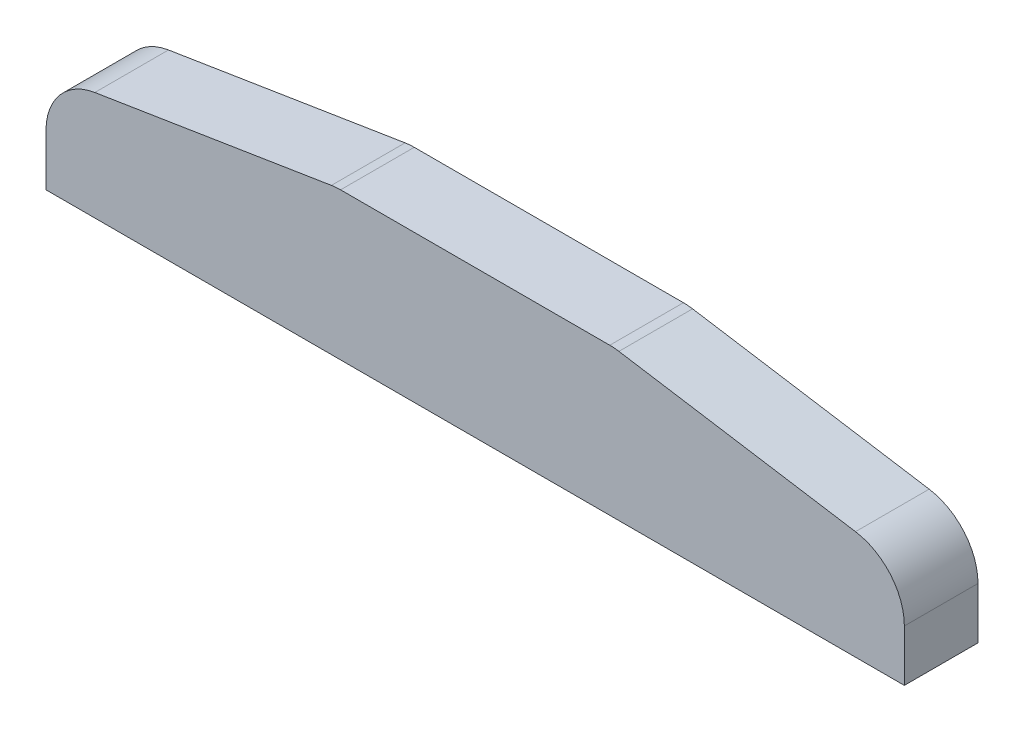
ISO-10303-21;
HEADER;
FILE_DESCRIPTION(('STEP AP214'),'2;1');
FILE_NAME('part.step','',(''),(''),'','','');
FILE_SCHEMA(('AUTOMOTIVE_DESIGN { 1 0 10303 214 1 1 1 1 }'));
ENDSEC;
DATA;
#1=APPLICATION_CONTEXT('core data for automotive mechanical design processes');
#2=APPLICATION_PROTOCOL_DEFINITION('international standard','automotive_design',2000,#1);
#3=PRODUCT_CONTEXT('',#1,'mechanical');
#4=PRODUCT('Part','Part','',(#3));
#5=PRODUCT_RELATED_PRODUCT_CATEGORY('part','',(#4));
#6=PRODUCT_DEFINITION_FORMATION('','',#4);
#7=PRODUCT_DEFINITION_CONTEXT('part definition',#1,'design');
#8=PRODUCT_DEFINITION('design','',#6,#7);
#9=PRODUCT_DEFINITION_SHAPE('','',#8);
#10=(LENGTH_UNIT() NAMED_UNIT(*) SI_UNIT(.MILLI.,.METRE.));
#11=(NAMED_UNIT(*) PLANE_ANGLE_UNIT() SI_UNIT($,.RADIAN.));
#12=(NAMED_UNIT(*) SI_UNIT($,.STERADIAN.) SOLID_ANGLE_UNIT());
#13=UNCERTAINTY_MEASURE_WITH_UNIT(LENGTH_MEASURE(1.E-05),#10,'distance_accuracy_value','');
#14=(GEOMETRIC_REPRESENTATION_CONTEXT(3) GLOBAL_UNCERTAINTY_ASSIGNED_CONTEXT((#13)) GLOBAL_UNIT_ASSIGNED_CONTEXT((#10,
#11,#12)) REPRESENTATION_CONTEXT('',''));
#15=CARTESIAN_POINT('',(0.,0.,0.));
#16=DIRECTION('',(0.,0.,1.));
#17=DIRECTION('',(1.,0.,0.));
#18=AXIS2_PLACEMENT_3D('',#15,#16,#17);
#19=CARTESIAN_POINT('',(73.9999999999998,25.3999999999999,6.35000000000002));
#20=DIRECTION('',(-0.999999999999997,0.,0.));
#21=DIRECTION('',(0.,0.,0.999999999999998));
#22=AXIS2_PLACEMENT_3D('',#19,#20,#21);
#23=PLANE('',#22);
#24=DIRECTION('',(0.,-1.,0.));
#25=VECTOR('',#24,1.);
#26=CARTESIAN_POINT('',(74.0000000000018,25.3999999999999,-6.35000000000019));
#27=LINE('',#26,#25);
#28=CARTESIAN_POINT('',(74.0000000000021,8.87280887906217,-6.34999999999997));
#29=VERTEX_POINT('',#28);
#30=CARTESIAN_POINT('',(74.0000000000018,-1.11022302462516E-13,-6.35000000000019));
#31=VERTEX_POINT('',#30);
#32=EDGE_CURVE('E182',#29,#31,#27,.T.);
#33=ORIENTED_EDGE('',*,*,#32,.F.);
#34=DIRECTION('',(0.,0.,-0.999999999999998));
#35=VECTOR('',#34,1.);
#36=CARTESIAN_POINT('',(73.9999999999998,8.87280887905606,6.35000000000002));
#37=LINE('',#36,#35);
#38=CARTESIAN_POINT('',(73.9999999999998,8.87280887905606,6.35000000000002));
#39=VERTEX_POINT('',#38);
#40=EDGE_CURVE('E195',#29,#39,#37,.F.);
#41=ORIENTED_EDGE('',*,*,#40,.T.);
#42=DIRECTION('',(0.,-1.,0.));
#43=VECTOR('',#42,1.);
#44=CARTESIAN_POINT('',(73.9999999999998,25.3999999999999,6.35000000000002));
#45=LINE('',#44,#43);
#46=CARTESIAN_POINT('',(73.9999999999998,-6.21724893790088E-12,6.35000000000002));
#47=VERTEX_POINT('',#46);
#48=EDGE_CURVE('E166',#39,#47,#45,.T.);
#49=ORIENTED_EDGE('',*,*,#48,.T.);
#50=DIRECTION('',(0.,0.,-0.999999999999998));
#51=VECTOR('',#50,1.);
#52=CARTESIAN_POINT('',(73.9999999999998,-6.21724893790088E-12,6.35000000000002));
#53=LINE('',#52,#51);
#54=EDGE_CURVE('E158',#47,#31,#53,.T.);
#55=ORIENTED_EDGE('',*,*,#54,.T.);
#56=EDGE_LOOP('',(#33,#41,#49,#55));
#57=FACE_BOUND('',#56,.T.);
#58=ADVANCED_FACE('F38',(#57),#23,.F.);
#59=CARTESIAN_POINT('',(-73.9999999999996,25.4,-6.35000000000013));
#60=DIRECTION('',(0.,0.,0.999999999999998));
#61=DIRECTION('',(0.999999999999997,0.,0.));
#62=AXIS2_PLACEMENT_3D('',#59,#60,#61);
#63=PLANE('',#62);
#64=DIRECTION('',(-0.987440631916702,0.157990501106667,0.));
#65=VECTOR('',#64,1.);
#66=CARTESIAN_POINT('',(23.9999999999989,25.4,-6.35000000000002));
#67=LINE('',#66,#65);
#68=CARTESIAN_POINT('',(24.7849605052042,25.2744063191671,-6.35000000000008));
#69=VERTEX_POINT('',#68);
#70=CARTESIAN_POINT('',(65.579905011069,18.7472151982231,-6.3499999999998));
#71=VERTEX_POINT('',#70);
#72=EDGE_CURVE('E186',#69,#71,#67,.F.);
#73=ORIENTED_EDGE('',*,*,#72,.T.);
#74=CARTESIAN_POINT('',(64.0000000000001,8.87280887905606,-6.3499999999998));
#75=DIRECTION('',(0.,0.,0.999999999999998));
#76=DIRECTION('',(0.999999999999997,0.,0.));
#77=AXIS2_PLACEMENT_3D('',#74,#75,#76);
#78=CIRCLE('',#77,10.);
#79=EDGE_CURVE('E215',#71,#29,#78,.F.);
#80=ORIENTED_EDGE('',*,*,#79,.T.);
#81=ORIENTED_EDGE('',*,*,#32,.T.);
#82=DIRECTION('',(-0.999999999999997,0.,0.));
#83=VECTOR('',#82,1.);
#84=CARTESIAN_POINT('',(-73.9999999999965,1.11022302462516E-13,-6.34999999999963));
#85=LINE('',#84,#83);
#86=CARTESIAN_POINT('',(-73.9999999999965,1.11022302462516E-13,-6.34999999999963));
#87=VERTEX_POINT('',#86);
#88=EDGE_CURVE('E169',#31,#87,#85,.T.);
#89=ORIENTED_EDGE('',*,*,#88,.T.);
#90=DIRECTION('',(0.,-1.,0.));
#91=VECTOR('',#90,1.);
#92=CARTESIAN_POINT('',(-73.9999999999996,25.4,-6.35000000000013));
#93=LINE('',#92,#91);
#94=CARTESIAN_POINT('',(-73.9999999999963,8.87280887906228,-6.34999999999869));
#95=VERTEX_POINT('',#94);
#96=EDGE_CURVE('E180',#95,#87,#93,.T.);
#97=ORIENTED_EDGE('',*,*,#96,.F.);
#98=CARTESIAN_POINT('',(-63.9999999999992,8.87280887906217,-6.34999999999886));
#99=DIRECTION('',(0.,0.,0.999999999999998));
#100=DIRECTION('',(0.999999999999997,0.,0.));
#101=AXIS2_PLACEMENT_3D('',#98,#99,#100);
#102=CIRCLE('',#101,10.);
#103=CARTESIAN_POINT('',(-65.5799050110648,18.7472151982293,-6.3499999999983));
#104=VERTEX_POINT('',#103);
#105=EDGE_CURVE('E59',#95,#104,#102,.F.);
#106=ORIENTED_EDGE('',*,*,#105,.T.);
#107=DIRECTION('',(-0.987440631916706,-0.157990501106673,0.));
#108=VECTOR('',#107,1.);
#109=CARTESIAN_POINT('',(-23.9999999999982,25.4,-6.35000000000008));
#110=LINE('',#109,#108);
#111=CARTESIAN_POINT('',(-24.7849605052024,25.274406319167,-6.35000000000063));
#112=VERTEX_POINT('',#111);
#113=EDGE_CURVE('E184',#104,#112,#110,.F.);
#114=ORIENTED_EDGE('',*,*,#113,.T.);
#115=CARTESIAN_POINT('',(-23.2050554941368,15.4,-6.35000000000013));
#116=DIRECTION('',(0.,0.,0.999999999999998));
#117=DIRECTION('',(0.999999999999997,0.,0.));
#118=AXIS2_PLACEMENT_3D('',#115,#116,#117);
#119=CIRCLE('',#118,10.);
#120=CARTESIAN_POINT('',(-23.2050554941368,25.4,-6.35000000000024));
#121=VERTEX_POINT('',#120);
#122=EDGE_CURVE('E211',#112,#121,#119,.F.);
#123=ORIENTED_EDGE('',*,*,#122,.T.);
#124=DIRECTION('',(-0.999999999999997,0.,0.));
#125=VECTOR('',#124,1.);
#126=CARTESIAN_POINT('',(-73.9999999999996,25.4,-6.35000000000013));
#127=LINE('',#126,#125);
#128=CARTESIAN_POINT('',(23.2050554941383,25.4,-6.35000000000002));
#129=VERTEX_POINT('',#128);
#130=EDGE_CURVE('E159',#129,#121,#127,.T.);
#131=ORIENTED_EDGE('',*,*,#130,.F.);
#132=CARTESIAN_POINT('',(23.2050554941385,15.4,-6.34999999999991));
#133=DIRECTION('',(0.,0.,0.999999999999998));
#134=DIRECTION('',(0.999999999999997,0.,0.));
#135=AXIS2_PLACEMENT_3D('',#132,#133,#134);
#136=CIRCLE('',#135,10.);
#137=EDGE_CURVE('E213',#129,#69,#136,.F.);
#138=ORIENTED_EDGE('',*,*,#137,.T.);
#139=EDGE_LOOP('',(#73,#80,#81,#89,#97,#106,#114,#123,#131,#138));
#140=FACE_BOUND('',#139,.T.);
#141=ADVANCED_FACE('F236',(#140),#63,.F.);
#142=CARTESIAN_POINT('',(-73.9999999999998,25.4,6.35000000000002));
#143=DIRECTION('',(0.999999999999997,0.,0.));
#144=DIRECTION('',(0.,0.,-0.999999999999998));
#145=AXIS2_PLACEMENT_3D('',#142,#143,#144);
#146=PLANE('',#145);
#147=DIRECTION('',(0.,-1.,0.));
#148=VECTOR('',#147,1.);
#149=CARTESIAN_POINT('',(-73.9999999999998,25.4,6.35000000000002));
#150=LINE('',#149,#148);
#151=CARTESIAN_POINT('',(-73.9999999999998,8.87280887906217,6.35000000000002));
#152=VERTEX_POINT('',#151);
#153=CARTESIAN_POINT('',(-73.9999999999998,0.,6.35000000000002));
#154=VERTEX_POINT('',#153);
#155=EDGE_CURVE('E178',#152,#154,#150,.T.);
#156=ORIENTED_EDGE('',*,*,#155,.F.);
#157=DIRECTION('',(0.,0.,0.999999999999998));
#158=VECTOR('',#157,1.);
#159=CARTESIAN_POINT('',(-73.9999999999963,8.87280887906228,-6.34999999999869));
#160=LINE('',#159,#158);
#161=EDGE_CURVE('E11',#152,#95,#160,.F.);
#162=ORIENTED_EDGE('',*,*,#161,.T.);
#163=ORIENTED_EDGE('',*,*,#96,.T.);
#164=DIRECTION('',(0.,0.,0.999999999999998));
#165=VECTOR('',#164,1.);
#166=CARTESIAN_POINT('',(-73.9999999999998,0.,6.35000000000002));
#167=LINE('',#166,#165);
#168=EDGE_CURVE('E172',#87,#154,#167,.T.);
#169=ORIENTED_EDGE('',*,*,#168,.T.);
#170=EDGE_LOOP('',(#156,#162,#163,#169));
#171=FACE_BOUND('',#170,.T.);
#172=ADVANCED_FACE('F235',(#171),#146,.F.);
#173=CARTESIAN_POINT('',(-73.9999999999998,25.4,6.35000000000002));
#174=DIRECTION('',(0.,0.,-0.999999999999998));
#175=DIRECTION('',(-0.999999999999997,0.,0.));
#176=AXIS2_PLACEMENT_3D('',#173,#174,#175);
#177=PLANE('',#176);
#178=ORIENTED_EDGE('',*,*,#48,.F.);
#179=CARTESIAN_POINT('',(64.0000000000001,8.87280887906217,6.35000000000002));
#180=DIRECTION('',(0.,0.,-0.999999999999998));
#181=DIRECTION('',(-0.999999999999997,0.,0.));
#182=AXIS2_PLACEMENT_3D('',#179,#180,#181);
#183=CIRCLE('',#182,10.);
#184=CARTESIAN_POINT('',(65.5799050110668,18.7472151982292,6.35000000000008));
#185=VERTEX_POINT('',#184);
#186=EDGE_CURVE('E204',#39,#185,#183,.F.);
#187=ORIENTED_EDGE('',*,*,#186,.T.);
#188=DIRECTION('',(0.987440631916702,-0.157990501106667,0.));
#189=VECTOR('',#188,1.);
#190=CARTESIAN_POINT('',(24.0000000000007,25.4000000000061,6.34999999999963));
#191=LINE('',#190,#189);
#192=CARTESIAN_POINT('',(24.7849605052051,25.2744063191732,6.34999999999991));
#193=VERTEX_POINT('',#192);
#194=EDGE_CURVE('E192',#185,#193,#191,.F.);
#195=ORIENTED_EDGE('',*,*,#194,.T.);
#196=CARTESIAN_POINT('',(23.205055494139,15.4000000000061,6.35000000000008));
#197=DIRECTION('',(0.,0.,-0.999999999999998));
#198=DIRECTION('',(-0.999999999999997,0.,0.));
#199=AXIS2_PLACEMENT_3D('',#196,#197,#198);
#200=CIRCLE('',#199,10.);
#201=CARTESIAN_POINT('',(23.205055494139,25.4000000000061,6.35000000000002));
#202=VERTEX_POINT('',#201);
#203=EDGE_CURVE('E202',#193,#202,#200,.F.);
#204=ORIENTED_EDGE('',*,*,#203,.T.);
#205=DIRECTION('',(0.999999999999997,0.,0.));
#206=VECTOR('',#205,1.);
#207=CARTESIAN_POINT('',(-73.9999999999998,25.4,6.35000000000002));
#208=LINE('',#207,#206);
#209=CARTESIAN_POINT('',(-23.2050554941388,25.4,6.34999999999997));
#210=VERTEX_POINT('',#209);
#211=EDGE_CURVE('E162',#210,#202,#208,.T.);
#212=ORIENTED_EDGE('',*,*,#211,.F.);
#213=CARTESIAN_POINT('',(-23.2050554941388,15.4,6.35000000000008));
#214=DIRECTION('',(0.,0.,-0.999999999999998));
#215=DIRECTION('',(-0.999999999999997,0.,0.));
#216=AXIS2_PLACEMENT_3D('',#213,#214,#215);
#217=CIRCLE('',#216,10.);
#218=CARTESIAN_POINT('',(-24.7849605052046,25.274406319167,6.35000000000024));
#219=VERTEX_POINT('',#218);
#220=EDGE_CURVE('E200',#210,#219,#217,.F.);
#221=ORIENTED_EDGE('',*,*,#220,.T.);
#222=DIRECTION('',(0.987440631916706,0.157990501106673,0.));
#223=VECTOR('',#222,1.);
#224=CARTESIAN_POINT('',(-24.0000000000007,25.4,6.35000000000008));
#225=LINE('',#224,#223);
#226=CARTESIAN_POINT('',(-65.5799050110686,18.7472151982293,6.3500000000008));
#227=VERTEX_POINT('',#226);
#228=EDGE_CURVE('E189',#219,#227,#225,.F.);
#229=ORIENTED_EDGE('',*,*,#228,.T.);
#230=CARTESIAN_POINT('',(-64.0000000000001,8.87280887906217,6.35000000000002));
#231=DIRECTION('',(0.,0.,-0.999999999999998));
#232=DIRECTION('',(-0.999999999999997,0.,0.));
#233=AXIS2_PLACEMENT_3D('',#230,#231,#232);
#234=CIRCLE('',#233,10.);
#235=EDGE_CURVE('E198',#227,#152,#234,.F.);
#236=ORIENTED_EDGE('',*,*,#235,.T.);
#237=ORIENTED_EDGE('',*,*,#155,.T.);
#238=DIRECTION('',(0.999999999999997,0.,0.));
#239=VECTOR('',#238,1.);
#240=CARTESIAN_POINT('',(-73.9999999999998,0.,6.35000000000002));
#241=LINE('',#240,#239);
#242=EDGE_CURVE('E163',#154,#47,#241,.T.);
#243=ORIENTED_EDGE('',*,*,#242,.T.);
#244=EDGE_LOOP('',(#178,#187,#195,#204,#212,#221,#229,#236,#237,#243));
#245=FACE_BOUND('',#244,.T.);
#246=ADVANCED_FACE('F230',(#245),#177,.F.);
#247=CARTESIAN_POINT('',(0.,25.4,0.));
#248=DIRECTION('',(0.,-1.,0.));
#249=DIRECTION('',(0.,0.,-0.999999999999998));
#250=AXIS2_PLACEMENT_3D('',#247,#248,#249);
#251=PLANE('',#250);
#252=ORIENTED_EDGE('',*,*,#211,.T.);
#253=DIRECTION('',(0.,0.,0.999999999999998));
#254=VECTOR('',#253,1.);
#255=CARTESIAN_POINT('',(23.2050554941383,25.4,-6.35000000000002));
#256=LINE('',#255,#254);
#257=EDGE_CURVE('E220',#202,#129,#256,.F.);
#258=ORIENTED_EDGE('',*,*,#257,.T.);
#259=ORIENTED_EDGE('',*,*,#130,.T.);
#260=DIRECTION('',(0.,0.,-0.999999999999998));
#261=VECTOR('',#260,1.);
#262=CARTESIAN_POINT('',(-23.2050554941388,25.4,6.34999999999997));
#263=LINE('',#262,#261);
#264=EDGE_CURVE('E217',#121,#210,#263,.F.);
#265=ORIENTED_EDGE('',*,*,#264,.T.);
#266=EDGE_LOOP('',(#252,#258,#259,#265));
#267=FACE_BOUND('',#266,.T.);
#268=ADVANCED_FACE('F261',(#267),#251,.F.);
#269=CARTESIAN_POINT('',(0.,0.,0.));
#270=DIRECTION('',(0.,-1.,0.));
#271=DIRECTION('',(0.,0.,-0.999999999999998));
#272=AXIS2_PLACEMENT_3D('',#269,#270,#271);
#273=PLANE('',#272);
#274=CARTESIAN_POINT('',(-65.9999999999998,0.,-1.66533453693773E-13));
#275=DIRECTION('',(0.,-1.,0.));
#276=DIRECTION('',(0.,0.,-0.999999999999998));
#277=AXIS2_PLACEMENT_3D('',#274,#275,#276);
#278=CIRCLE('',#277,2.09999999999999);
#279=CARTESIAN_POINT('',(-65.9999999999998,0.,-2.10000000000015));
#280=VERTEX_POINT('',#279);
#281=EDGE_CURVE('E136',#280,#280,#278,.T.);
#282=ORIENTED_EDGE('',*,*,#281,.F.);
#283=EDGE_LOOP('',(#282));
#284=FACE_BOUND('',#283,.T.);
#285=CARTESIAN_POINT('',(-22.,0.,0.));
#286=DIRECTION('',(0.,-1.,0.));
#287=DIRECTION('',(0.,0.,-0.999999999999998));
#288=AXIS2_PLACEMENT_3D('',#285,#286,#287);
#289=CIRCLE('',#288,2.09999999999999);
#290=CARTESIAN_POINT('',(-22.,0.,-2.09999999999999));
#291=VERTEX_POINT('',#290);
#292=EDGE_CURVE('E135',#291,#291,#289,.T.);
#293=ORIENTED_EDGE('',*,*,#292,.F.);
#294=EDGE_LOOP('',(#293));
#295=FACE_BOUND('',#294,.T.);
#296=CARTESIAN_POINT('',(21.9999999999991,0.,-2.22044604925031E-13));
#297=DIRECTION('',(0.,-1.,0.));
#298=DIRECTION('',(0.,0.,-0.999999999999998));
#299=AXIS2_PLACEMENT_3D('',#296,#297,#298);
#300=CIRCLE('',#299,2.09999999999999);
#301=CARTESIAN_POINT('',(21.9999999999991,0.,-2.10000000000021));
#302=VERTEX_POINT('',#301);
#303=EDGE_CURVE('E146',#302,#302,#300,.T.);
#304=ORIENTED_EDGE('',*,*,#303,.F.);
#305=EDGE_LOOP('',(#304));
#306=FACE_BOUND('',#305,.T.);
#307=CARTESIAN_POINT('',(66.0000000000003,-1.11022302462516E-13,-1.66533453693773E-13));
#308=DIRECTION('',(0.,-1.,0.));
#309=DIRECTION('',(0.,0.,-0.999999999999998));
#310=AXIS2_PLACEMENT_3D('',#307,#308,#309);
#311=CIRCLE('',#310,2.09999999999999);
#312=CARTESIAN_POINT('',(66.0000000000003,-1.10231421326095E-13,-2.10000000000015));
#313=VERTEX_POINT('',#312);
#314=EDGE_CURVE('E152',#313,#313,#311,.T.);
#315=ORIENTED_EDGE('',*,*,#314,.F.);
#316=EDGE_LOOP('',(#315));
#317=FACE_BOUND('',#316,.T.);
#318=ORIENTED_EDGE('',*,*,#54,.F.);
#319=ORIENTED_EDGE('',*,*,#242,.F.);
#320=ORIENTED_EDGE('',*,*,#168,.F.);
#321=ORIENTED_EDGE('',*,*,#88,.F.);
#322=EDGE_LOOP('',(#318,#319,#320,#321));
#323=FACE_BOUND('',#322,.T.);
#324=ADVANCED_FACE('F243',(#284,#295,#306,#317,#323),#273,.T.);
#325=CARTESIAN_POINT('',(23.9999999999989,25.4,0.));
#326=DIRECTION('',(-0.157990501106671,-0.987440631916706,0.));
#327=DIRECTION('',(0.,0.,-0.999999999999998));
#328=AXIS2_PLACEMENT_3D('',#325,#326,#327);
#329=PLANE('',#328);
#330=ORIENTED_EDGE('',*,*,#194,.F.);
#331=DIRECTION('',(0.,0.,0.999999999999998));
#332=VECTOR('',#331,1.);
#333=CARTESIAN_POINT('',(65.579905011069,18.7472151982231,-6.3499999999998));
#334=LINE('',#333,#332);
#335=EDGE_CURVE('E208',#185,#71,#334,.F.);
#336=ORIENTED_EDGE('',*,*,#335,.T.);
#337=ORIENTED_EDGE('',*,*,#72,.F.);
#338=DIRECTION('',(0.,0.,-0.999999999999998));
#339=VECTOR('',#338,1.);
#340=CARTESIAN_POINT('',(24.7849605052051,25.2744063191732,6.34999999999991));
#341=LINE('',#340,#339);
#342=EDGE_CURVE('E206',#69,#193,#341,.F.);
#343=ORIENTED_EDGE('',*,*,#342,.T.);
#344=EDGE_LOOP('',(#330,#336,#337,#343));
#345=FACE_BOUND('',#344,.T.);
#346=ADVANCED_FACE('F253',(#345),#329,.F.);
#347=CARTESIAN_POINT('',(-23.9999999999989,25.4,-3.88578058618805E-13));
#348=DIRECTION('',(0.157990501106666,-0.987440631916706,0.));
#349=DIRECTION('',(0.,0.,0.999999999999998));
#350=AXIS2_PLACEMENT_3D('',#347,#348,#349);
#351=PLANE('',#350);
#352=ORIENTED_EDGE('',*,*,#228,.F.);
#353=DIRECTION('',(0.,0.,0.999999999999998));
#354=VECTOR('',#353,1.);
#355=CARTESIAN_POINT('',(-24.7849605052024,25.274406319167,-6.35000000000063));
#356=LINE('',#355,#354);
#357=EDGE_CURVE('E46',#219,#112,#356,.F.);
#358=ORIENTED_EDGE('',*,*,#357,.T.);
#359=ORIENTED_EDGE('',*,*,#113,.F.);
#360=DIRECTION('',(0.,0.,-0.999999999999998));
#361=VECTOR('',#360,1.);
#362=CARTESIAN_POINT('',(-65.5799050110686,18.7472151982293,6.3500000000008));
#363=LINE('',#362,#361);
#364=EDGE_CURVE('E223',#104,#227,#363,.F.);
#365=ORIENTED_EDGE('',*,*,#364,.T.);
#366=EDGE_LOOP('',(#352,#358,#359,#365));
#367=FACE_BOUND('',#366,.T.);
#368=ADVANCED_FACE('F225',(#367),#351,.F.);
#369=CARTESIAN_POINT('',(66.0000000000021,11.9999999999999,5.55111512312578E-13));
#370=DIRECTION('',(0.,-1.,0.));
#371=DIRECTION('',(0.,0.,-0.999999999999998));
#372=AXIS2_PLACEMENT_3D('',#369,#370,#371);
#373=CONICAL_SURFACE('',#372,2.09999999999999,1.02974425867665);
#374=CARTESIAN_POINT('',(66.0000000000021,13.2618072999577,5.55111512312578E-13));
#375=VERTEX_POINT('',#374);
#376=VERTEX_LOOP('',#375);
#377=FACE_BOUND('',#376,.T.);
#378=CARTESIAN_POINT('',(66.0000000000021,11.9999999999999,5.55111512312578E-13));
#379=DIRECTION('',(0.,-1.,0.));
#380=DIRECTION('',(0.,0.,-0.999999999999998));
#381=AXIS2_PLACEMENT_3D('',#378,#379,#380);
#382=CIRCLE('',#381,2.09999999999999);
#383=CARTESIAN_POINT('',(66.0000000000021,11.9999999999999,-2.09999999999943));
#384=VERTEX_POINT('',#383);
#385=EDGE_CURVE('E155',#384,#384,#382,.T.);
#386=ORIENTED_EDGE('',*,*,#385,.T.);
#387=EDGE_LOOP('',(#386));
#388=FACE_BOUND('',#387,.T.);
#389=ADVANCED_FACE('F284',(#377,#388),#373,.F.);
#390=CARTESIAN_POINT('',(66.0000000000003,-1.11022302462516E-13,-1.66533453693773E-13));
#391=DIRECTION('',(0.,-1.,0.));
#392=DIRECTION('',(0.,0.,-0.999999999999998));
#393=AXIS2_PLACEMENT_3D('',#390,#391,#392);
#394=CYLINDRICAL_SURFACE('',#393,2.09999999999999);
#395=ORIENTED_EDGE('',*,*,#385,.F.);
#396=EDGE_LOOP('',(#395));
#397=FACE_BOUND('',#396,.T.);
#398=ORIENTED_EDGE('',*,*,#314,.T.);
#399=EDGE_LOOP('',(#398));
#400=FACE_BOUND('',#399,.T.);
#401=ADVANCED_FACE('F308',(#397,#400),#394,.F.);
#402=CARTESIAN_POINT('',(21.9999999999991,12.,-2.22044604925031E-13));
#403=DIRECTION('',(0.,-1.,0.));
#404=DIRECTION('',(0.,0.,-0.999999999999998));
#405=AXIS2_PLACEMENT_3D('',#402,#403,#404);
#406=CONICAL_SURFACE('',#405,2.1,1.02974425867665);
#407=CARTESIAN_POINT('',(21.9999999999991,13.2618072999579,-2.22044604925031E-13));
#408=VERTEX_POINT('',#407);
#409=VERTEX_LOOP('',#408);
#410=FACE_BOUND('',#409,.T.);
#411=CARTESIAN_POINT('',(21.9999999999991,12.,-2.22044604925031E-13));
#412=DIRECTION('',(0.,-1.,0.));
#413=DIRECTION('',(0.,0.,-0.999999999999998));
#414=AXIS2_PLACEMENT_3D('',#411,#412,#413);
#415=CIRCLE('',#414,2.1);
#416=CARTESIAN_POINT('',(21.9999999999991,12.,-2.10000000000022));
#417=VERTEX_POINT('',#416);
#418=EDGE_CURVE('E149',#417,#417,#415,.T.);
#419=ORIENTED_EDGE('',*,*,#418,.T.);
#420=EDGE_LOOP('',(#419));
#421=FACE_BOUND('',#420,.T.);
#422=ADVANCED_FACE('F304',(#410,#421),#406,.F.);
#423=CARTESIAN_POINT('',(21.9999999999991,0.,-2.22044604925031E-13));
#424=DIRECTION('',(0.,-1.,0.));
#425=DIRECTION('',(0.,0.,-0.999999999999998));
#426=AXIS2_PLACEMENT_3D('',#423,#424,#425);
#427=CYLINDRICAL_SURFACE('',#426,2.09999999999999);
#428=ORIENTED_EDGE('',*,*,#418,.F.);
#429=EDGE_LOOP('',(#428));
#430=FACE_BOUND('',#429,.T.);
#431=ORIENTED_EDGE('',*,*,#303,.T.);
#432=EDGE_LOOP('',(#431));
#433=FACE_BOUND('',#432,.T.);
#434=ADVANCED_FACE('F300',(#430,#433),#427,.F.);
#435=CARTESIAN_POINT('',(-22.,12.,0.));
#436=DIRECTION('',(0.,-1.,0.));
#437=DIRECTION('',(0.,0.,-0.999999999999998));
#438=AXIS2_PLACEMENT_3D('',#435,#436,#437);
#439=CONICAL_SURFACE('',#438,2.1,1.02974425867665);
#440=CARTESIAN_POINT('',(-22.,13.2618072999579,0.));
#441=VERTEX_POINT('',#440);
#442=VERTEX_LOOP('',#441);
#443=FACE_BOUND('',#442,.T.);
#444=CARTESIAN_POINT('',(-22.,12.,0.));
#445=DIRECTION('',(0.,-1.,0.));
#446=DIRECTION('',(0.,0.,-0.999999999999998));
#447=AXIS2_PLACEMENT_3D('',#444,#445,#446);
#448=CIRCLE('',#447,2.1);
#449=CARTESIAN_POINT('',(-22.,12.,-2.09999999999999));
#450=VERTEX_POINT('',#449);
#451=EDGE_CURVE('E139',#450,#450,#448,.T.);
#452=ORIENTED_EDGE('',*,*,#451,.T.);
#453=EDGE_LOOP('',(#452));
#454=FACE_BOUND('',#453,.T.);
#455=ADVANCED_FACE('F296',(#443,#454),#439,.F.);
#456=CARTESIAN_POINT('',(-22.,0.,0.));
#457=DIRECTION('',(0.,-1.,0.));
#458=DIRECTION('',(0.,0.,-0.999999999999998));
#459=AXIS2_PLACEMENT_3D('',#456,#457,#458);
#460=CYLINDRICAL_SURFACE('',#459,2.09999999999999);
#461=ORIENTED_EDGE('',*,*,#451,.F.);
#462=EDGE_LOOP('',(#461));
#463=FACE_BOUND('',#462,.T.);
#464=ORIENTED_EDGE('',*,*,#292,.T.);
#465=EDGE_LOOP('',(#464));
#466=FACE_BOUND('',#465,.T.);
#467=ADVANCED_FACE('F129',(#463,#466),#460,.F.);
#468=CARTESIAN_POINT('',(-65.9999999999998,12.,-1.66533453693773E-13));
#469=DIRECTION('',(0.,-1.,0.));
#470=DIRECTION('',(0.,0.,-0.999999999999998));
#471=AXIS2_PLACEMENT_3D('',#468,#469,#470);
#472=CONICAL_SURFACE('',#471,2.09999999999999,1.02974425867665);
#473=CARTESIAN_POINT('',(-65.9999999999998,13.2618072999579,-1.66533453693773E-13));
#474=VERTEX_POINT('',#473);
#475=VERTEX_LOOP('',#474);
#476=FACE_BOUND('',#475,.T.);
#477=CARTESIAN_POINT('',(-65.9999999999998,12.,-1.66533453693773E-13));
#478=DIRECTION('',(0.,-1.,0.));
#479=DIRECTION('',(0.,0.,-0.999999999999998));
#480=AXIS2_PLACEMENT_3D('',#477,#478,#479);
#481=CIRCLE('',#480,2.09999999999999);
#482=CARTESIAN_POINT('',(-65.9999999999998,12.,-2.10000000000015));
#483=VERTEX_POINT('',#482);
#484=EDGE_CURVE('E133',#483,#483,#481,.T.);
#485=ORIENTED_EDGE('',*,*,#484,.T.);
#486=EDGE_LOOP('',(#485));
#487=FACE_BOUND('',#486,.T.);
#488=ADVANCED_FACE('F125',(#476,#487),#472,.F.);
#489=CARTESIAN_POINT('',(-65.9999999999998,0.,-1.66533453693773E-13));
#490=DIRECTION('',(0.,-1.,0.));
#491=DIRECTION('',(0.,0.,-0.999999999999998));
#492=AXIS2_PLACEMENT_3D('',#489,#490,#491);
#493=CYLINDRICAL_SURFACE('',#492,2.09999999999999);
#494=ORIENTED_EDGE('',*,*,#484,.F.);
#495=EDGE_LOOP('',(#494));
#496=FACE_BOUND('',#495,.T.);
#497=ORIENTED_EDGE('',*,*,#281,.T.);
#498=EDGE_LOOP('',(#497));
#499=FACE_BOUND('',#498,.T.);
#500=ADVANCED_FACE('F128',(#496,#499),#493,.F.);
#501=CARTESIAN_POINT('',(64.0000000000001,8.87280887906217,6.35000000000002));
#502=DIRECTION('',(0.,0.,0.999999999999998));
#503=DIRECTION('',(0.999999999999997,0.,0.));
#504=AXIS2_PLACEMENT_3D('',#501,#502,#503);
#505=CYLINDRICAL_SURFACE('',#504,10.);
#506=ORIENTED_EDGE('',*,*,#79,.F.);
#507=ORIENTED_EDGE('',*,*,#335,.F.);
#508=ORIENTED_EDGE('',*,*,#186,.F.);
#509=ORIENTED_EDGE('',*,*,#40,.F.);
#510=EDGE_LOOP('',(#506,#507,#508,#509));
#511=FACE_BOUND('',#510,.T.);
#512=ADVANCED_FACE('F249',(#511),#505,.T.);
#513=CARTESIAN_POINT('',(23.2050554941381,15.4,0.));
#514=DIRECTION('',(0.,0.,-0.999999999999998));
#515=DIRECTION('',(-0.999999999999997,0.,0.));
#516=AXIS2_PLACEMENT_3D('',#513,#514,#515);
#517=CYLINDRICAL_SURFACE('',#516,10.);
#518=ORIENTED_EDGE('',*,*,#203,.F.);
#519=ORIENTED_EDGE('',*,*,#342,.F.);
#520=ORIENTED_EDGE('',*,*,#137,.F.);
#521=ORIENTED_EDGE('',*,*,#257,.F.);
#522=EDGE_LOOP('',(#518,#519,#520,#521));
#523=FACE_BOUND('',#522,.T.);
#524=ADVANCED_FACE('F259',(#523),#517,.T.);
#525=CARTESIAN_POINT('',(-23.2050554941381,15.4,2.77555756156289E-13));
#526=DIRECTION('',(0.,0.,0.999999999999998));
#527=DIRECTION('',(0.999999999999997,0.,0.));
#528=AXIS2_PLACEMENT_3D('',#525,#526,#527);
#529=CYLINDRICAL_SURFACE('',#528,10.);
#530=ORIENTED_EDGE('',*,*,#122,.F.);
#531=ORIENTED_EDGE('',*,*,#357,.F.);
#532=ORIENTED_EDGE('',*,*,#220,.F.);
#533=ORIENTED_EDGE('',*,*,#264,.F.);
#534=EDGE_LOOP('',(#530,#531,#532,#533));
#535=FACE_BOUND('',#534,.T.);
#536=ADVANCED_FACE('F265',(#535),#529,.T.);
#537=CARTESIAN_POINT('',(-64.0000000000001,8.87280887906217,6.35000000000002));
#538=DIRECTION('',(0.,0.,-0.999999999999998));
#539=DIRECTION('',(-0.999999999999997,0.,0.));
#540=AXIS2_PLACEMENT_3D('',#537,#538,#539);
#541=CYLINDRICAL_SURFACE('',#540,10.);
#542=ORIENTED_EDGE('',*,*,#235,.F.);
#543=ORIENTED_EDGE('',*,*,#364,.F.);
#544=ORIENTED_EDGE('',*,*,#105,.F.);
#545=ORIENTED_EDGE('',*,*,#161,.F.);
#546=EDGE_LOOP('',(#542,#543,#544,#545));
#547=FACE_BOUND('',#546,.T.);
#548=ADVANCED_FACE('F40',(#547),#541,.T.);
#549=CLOSED_SHELL('',(#58,#141,#172,#246,#268,#324,#346,#368,#389,#401,#422,#434,#455,#467,#488,
#500,#512,#524,#536,#548));
#550=MANIFOLD_SOLID_BREP('B2',#549);
#551=ADVANCED_BREP_SHAPE_REPRESENTATION('',(#18,#550),#14);
#552=SHAPE_DEFINITION_REPRESENTATION(#9,#551);
ENDSEC;
END-ISO-10303-21;
